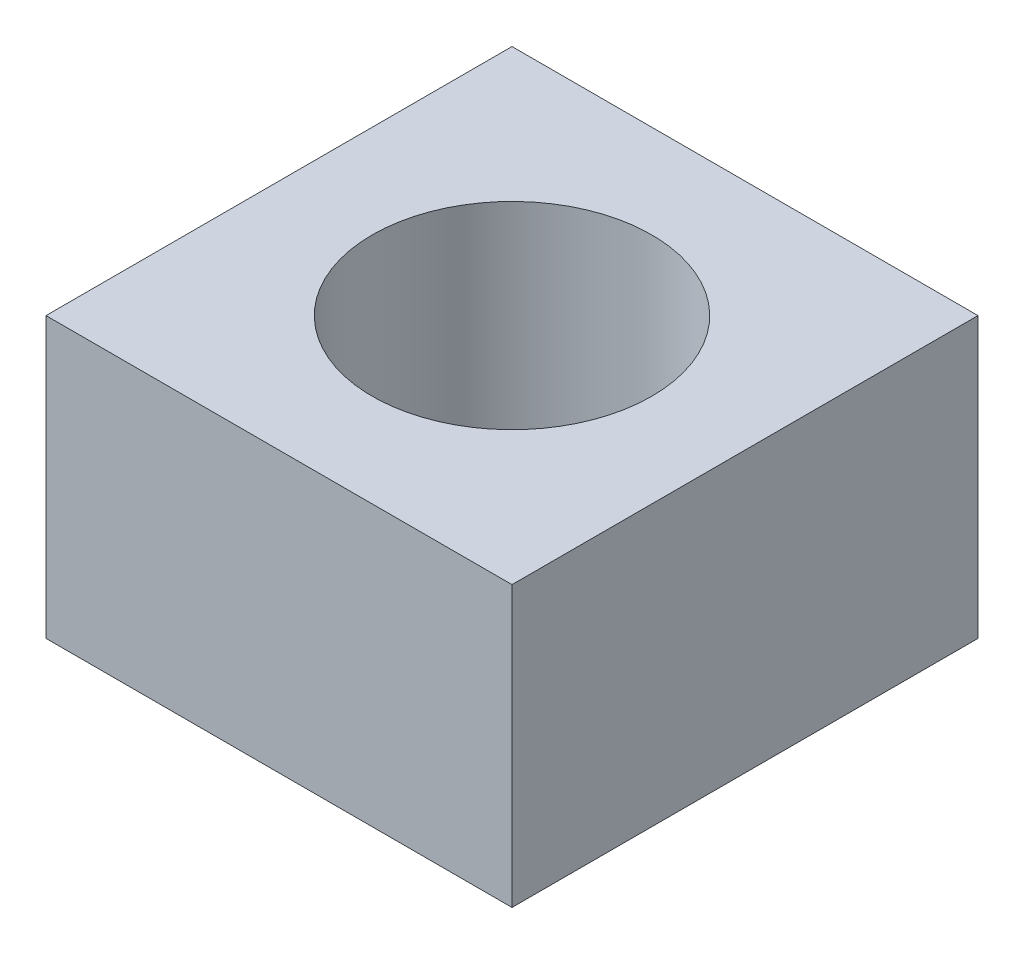
ISO-10303-21;
HEADER;
FILE_DESCRIPTION(('STEP AP214'),'2;1');
FILE_NAME('part.step','',(''),(''),'','','');
FILE_SCHEMA(('AUTOMOTIVE_DESIGN { 1 0 10303 214 1 1 1 1 }'));
ENDSEC;
DATA;
#1=APPLICATION_CONTEXT('core data for automotive mechanical design processes');
#2=APPLICATION_PROTOCOL_DEFINITION('international standard','automotive_design',2000,#1);
#3=PRODUCT_CONTEXT('',#1,'mechanical');
#4=PRODUCT('Part','Part','',(#3));
#5=PRODUCT_RELATED_PRODUCT_CATEGORY('part','',(#4));
#6=PRODUCT_DEFINITION_FORMATION('','',#4);
#7=PRODUCT_DEFINITION_CONTEXT('part definition',#1,'design');
#8=PRODUCT_DEFINITION('design','',#6,#7);
#9=PRODUCT_DEFINITION_SHAPE('','',#8);
#10=(LENGTH_UNIT() NAMED_UNIT(*) SI_UNIT(.MILLI.,.METRE.));
#11=(NAMED_UNIT(*) PLANE_ANGLE_UNIT() SI_UNIT($,.RADIAN.));
#12=(NAMED_UNIT(*) SI_UNIT($,.STERADIAN.) SOLID_ANGLE_UNIT());
#13=UNCERTAINTY_MEASURE_WITH_UNIT(LENGTH_MEASURE(1.E-05),#10,'distance_accuracy_value','');
#14=(GEOMETRIC_REPRESENTATION_CONTEXT(3) GLOBAL_UNCERTAINTY_ASSIGNED_CONTEXT((#13)) GLOBAL_UNIT_ASSIGNED_CONTEXT((#10,
#11,#12)) REPRESENTATION_CONTEXT('',''));
#15=CARTESIAN_POINT('',(0.,0.,0.));
#16=DIRECTION('',(0.,0.,1.));
#17=DIRECTION('',(1.,0.,0.));
#18=AXIS2_PLACEMENT_3D('',#15,#16,#17);
#19=CARTESIAN_POINT('',(0.,3.,5.));
#20=DIRECTION('',(1.,0.,0.));
#21=DIRECTION('',(0.,0.,-1.));
#22=AXIS2_PLACEMENT_3D('',#19,#20,#21);
#23=PLANE('',#22);
#24=DIRECTION('',(0.,-1.,0.));
#25=VECTOR('',#24,1.);
#26=CARTESIAN_POINT('',(0.,3.,0.));
#27=LINE('',#26,#25);
#28=CARTESIAN_POINT('',(0.,3.,0.));
#29=VERTEX_POINT('',#28);
#30=CARTESIAN_POINT('',(0.,0.,0.));
#31=VERTEX_POINT('',#30);
#32=EDGE_CURVE('E102',#29,#31,#27,.T.);
#33=ORIENTED_EDGE('',*,*,#32,.T.);
#34=DIRECTION('',(0.,0.,-1.));
#35=VECTOR('',#34,1.);
#36=CARTESIAN_POINT('',(0.,0.,5.));
#37=LINE('',#36,#35);
#38=CARTESIAN_POINT('',(0.,0.,5.));
#39=VERTEX_POINT('',#38);
#40=EDGE_CURVE('E11',#39,#31,#37,.T.);
#41=ORIENTED_EDGE('',*,*,#40,.F.);
#42=DIRECTION('',(0.,-1.,0.));
#43=VECTOR('',#42,1.);
#44=CARTESIAN_POINT('',(0.,3.,5.));
#45=LINE('',#44,#43);
#46=CARTESIAN_POINT('',(0.,3.,5.));
#47=VERTEX_POINT('',#46);
#48=EDGE_CURVE('E90',#47,#39,#45,.T.);
#49=ORIENTED_EDGE('',*,*,#48,.F.);
#50=DIRECTION('',(0.,0.,-1.));
#51=VECTOR('',#50,1.);
#52=CARTESIAN_POINT('',(0.,3.,5.));
#53=LINE('',#52,#51);
#54=EDGE_CURVE('E98',#47,#29,#53,.T.);
#55=ORIENTED_EDGE('',*,*,#54,.T.);
#56=EDGE_LOOP('',(#33,#41,#49,#55));
#57=FACE_BOUND('',#56,.T.);
#58=ADVANCED_FACE('F39',(#57),#23,.F.);
#59=CARTESIAN_POINT('',(0.,0.,5.));
#60=DIRECTION('',(0.,1.,0.));
#61=DIRECTION('',(0.,0.,1.));
#62=AXIS2_PLACEMENT_3D('',#59,#60,#61);
#63=PLANE('',#62);
#64=CARTESIAN_POINT('',(2.5,0.,2.5));
#65=DIRECTION('',(0.,1.,0.));
#66=DIRECTION('',(-1.,0.,0.));
#67=AXIS2_PLACEMENT_3D('',#64,#65,#66);
#68=CIRCLE('',#67,1.5);
#69=CARTESIAN_POINT('',(1.,0.,2.5));
#70=VERTEX_POINT('',#69);
#71=EDGE_CURVE('E105',#70,#70,#68,.T.);
#72=ORIENTED_EDGE('',*,*,#71,.T.);
#73=EDGE_LOOP('',(#72));
#74=FACE_BOUND('',#73,.T.);
#75=DIRECTION('',(1.,0.,0.));
#76=VECTOR('',#75,1.);
#77=CARTESIAN_POINT('',(0.,0.,0.));
#78=LINE('',#77,#76);
#79=CARTESIAN_POINT('',(5.,0.,0.));
#80=VERTEX_POINT('',#79);
#81=EDGE_CURVE('E94',#31,#80,#78,.T.);
#82=ORIENTED_EDGE('',*,*,#81,.T.);
#83=DIRECTION('',(0.,0.,-1.));
#84=VECTOR('',#83,1.);
#85=CARTESIAN_POINT('',(5.,0.,5.));
#86=LINE('',#85,#84);
#87=CARTESIAN_POINT('',(5.,0.,5.));
#88=VERTEX_POINT('',#87);
#89=EDGE_CURVE('E47',#88,#80,#86,.T.);
#90=ORIENTED_EDGE('',*,*,#89,.F.);
#91=DIRECTION('',(1.,0.,0.));
#92=VECTOR('',#91,1.);
#93=CARTESIAN_POINT('',(0.,0.,5.));
#94=LINE('',#93,#92);
#95=EDGE_CURVE('E85',#39,#88,#94,.T.);
#96=ORIENTED_EDGE('',*,*,#95,.F.);
#97=ORIENTED_EDGE('',*,*,#40,.T.);
#98=EDGE_LOOP('',(#82,#90,#96,#97));
#99=FACE_BOUND('',#98,.T.);
#100=ADVANCED_FACE('F93',(#74,#99),#63,.F.);
#101=CARTESIAN_POINT('',(5.,0.,5.));
#102=DIRECTION('',(-1.,0.,0.));
#103=DIRECTION('',(0.,0.,1.));
#104=AXIS2_PLACEMENT_3D('',#101,#102,#103);
#105=PLANE('',#104);
#106=DIRECTION('',(0.,1.,0.));
#107=VECTOR('',#106,1.);
#108=CARTESIAN_POINT('',(5.,0.,0.));
#109=LINE('',#108,#107);
#110=CARTESIAN_POINT('',(5.,3.,0.));
#111=VERTEX_POINT('',#110);
#112=EDGE_CURVE('E72',#80,#111,#109,.T.);
#113=ORIENTED_EDGE('',*,*,#112,.T.);
#114=DIRECTION('',(0.,0.,-1.));
#115=VECTOR('',#114,1.);
#116=CARTESIAN_POINT('',(5.,3.,5.));
#117=LINE('',#116,#115);
#118=CARTESIAN_POINT('',(5.,3.,5.));
#119=VERTEX_POINT('',#118);
#120=EDGE_CURVE('E95',#119,#111,#117,.T.);
#121=ORIENTED_EDGE('',*,*,#120,.F.);
#122=DIRECTION('',(0.,1.,0.));
#123=VECTOR('',#122,1.);
#124=CARTESIAN_POINT('',(5.,0.,5.));
#125=LINE('',#124,#123);
#126=EDGE_CURVE('E88',#88,#119,#125,.T.);
#127=ORIENTED_EDGE('',*,*,#126,.F.);
#128=ORIENTED_EDGE('',*,*,#89,.T.);
#129=EDGE_LOOP('',(#113,#121,#127,#128));
#130=FACE_BOUND('',#129,.T.);
#131=ADVANCED_FACE('F96',(#130),#105,.F.);
#132=CARTESIAN_POINT('',(5.,3.,5.));
#133=DIRECTION('',(0.,-1.,0.));
#134=DIRECTION('',(1.,0.,0.));
#135=AXIS2_PLACEMENT_3D('',#132,#133,#134);
#136=PLANE('',#135);
#137=CARTESIAN_POINT('',(2.5,3.,2.5));
#138=DIRECTION('',(0.,1.,0.));
#139=DIRECTION('',(-1.,0.,0.));
#140=AXIS2_PLACEMENT_3D('',#137,#138,#139);
#141=CIRCLE('',#140,1.5);
#142=CARTESIAN_POINT('',(0.999999999999999,3.,2.5));
#143=VERTEX_POINT('',#142);
#144=EDGE_CURVE('E116',#143,#143,#141,.T.);
#145=ORIENTED_EDGE('',*,*,#144,.F.);
#146=EDGE_LOOP('',(#145));
#147=FACE_BOUND('',#146,.T.);
#148=DIRECTION('',(-1.,0.,0.));
#149=VECTOR('',#148,1.);
#150=CARTESIAN_POINT('',(5.,3.,0.));
#151=LINE('',#150,#149);
#152=EDGE_CURVE('E78',#111,#29,#151,.T.);
#153=ORIENTED_EDGE('',*,*,#152,.T.);
#154=ORIENTED_EDGE('',*,*,#54,.F.);
#155=DIRECTION('',(-1.,0.,0.));
#156=VECTOR('',#155,1.);
#157=CARTESIAN_POINT('',(5.,3.,5.));
#158=LINE('',#157,#156);
#159=EDGE_CURVE('E55',#119,#47,#158,.T.);
#160=ORIENTED_EDGE('',*,*,#159,.F.);
#161=ORIENTED_EDGE('',*,*,#120,.T.);
#162=EDGE_LOOP('',(#153,#154,#160,#161));
#163=FACE_BOUND('',#162,.T.);
#164=ADVANCED_FACE('F110',(#147,#163),#136,.F.);
#165=CARTESIAN_POINT('',(0.,0.,5.));
#166=DIRECTION('',(0.,0.,1.));
#167=DIRECTION('',(1.,0.,0.));
#168=AXIS2_PLACEMENT_3D('',#165,#166,#167);
#169=PLANE('',#168);
#170=ORIENTED_EDGE('',*,*,#48,.T.);
#171=ORIENTED_EDGE('',*,*,#95,.T.);
#172=ORIENTED_EDGE('',*,*,#126,.T.);
#173=ORIENTED_EDGE('',*,*,#159,.T.);
#174=EDGE_LOOP('',(#170,#171,#172,#173));
#175=FACE_BOUND('',#174,.T.);
#176=ADVANCED_FACE('F86',(#175),#169,.T.);
#177=CARTESIAN_POINT('',(0.,0.,0.));
#178=DIRECTION('',(0.,0.,1.));
#179=DIRECTION('',(1.,0.,0.));
#180=AXIS2_PLACEMENT_3D('',#177,#178,#179);
#181=PLANE('',#180);
#182=ORIENTED_EDGE('',*,*,#32,.F.);
#183=ORIENTED_EDGE('',*,*,#152,.F.);
#184=ORIENTED_EDGE('',*,*,#112,.F.);
#185=ORIENTED_EDGE('',*,*,#81,.F.);
#186=EDGE_LOOP('',(#182,#183,#184,#185));
#187=FACE_BOUND('',#186,.T.);
#188=ADVANCED_FACE('F113',(#187),#181,.F.);
#189=CARTESIAN_POINT('',(2.5,0.,2.5));
#190=DIRECTION('',(0.,1.,0.));
#191=DIRECTION('',(-1.,0.,0.));
#192=AXIS2_PLACEMENT_3D('',#189,#190,#191);
#193=CYLINDRICAL_SURFACE('',#192,1.5);
#194=CARTESIAN_POINT('',(1.,0.,2.5));
#195=CARTESIAN_POINT('',(1.,0.0312499999999994,2.5));
#196=CARTESIAN_POINT('',(1.,0.0624999999999994,2.5));
#197=CARTESIAN_POINT('',(1.,0.124999999999999,2.5));
#198=CARTESIAN_POINT('',(1.,0.156249999999999,2.5));
#199=CARTESIAN_POINT('',(1.,0.218749999999999,2.5));
#200=CARTESIAN_POINT('',(1.,0.249999999999999,2.5));
#201=CARTESIAN_POINT('',(1.,0.3125,2.5));
#202=CARTESIAN_POINT('',(1.,0.34375,2.5));
#203=CARTESIAN_POINT('',(1.,0.40625,2.5));
#204=CARTESIAN_POINT('',(1.,0.4375,2.5));
#205=CARTESIAN_POINT('',(1.,0.5,2.5));
#206=CARTESIAN_POINT('',(1.,0.531249999999999,2.5));
#207=CARTESIAN_POINT('',(1.,0.59375,2.5));
#208=CARTESIAN_POINT('',(1.,0.624999999999999,2.5));
#209=CARTESIAN_POINT('',(1.,0.6875,2.5));
#210=CARTESIAN_POINT('',(1.,0.71875,2.5));
#211=CARTESIAN_POINT('',(1.,0.78125,2.5));
#212=CARTESIAN_POINT('',(1.,0.8125,2.5));
#213=CARTESIAN_POINT('',(1.,0.875,2.5));
#214=CARTESIAN_POINT('',(1.,0.90625,2.5));
#215=CARTESIAN_POINT('',(1.,0.96875,2.5));
#216=CARTESIAN_POINT('',(1.,0.999999999999999,2.5));
#217=CARTESIAN_POINT('',(1.,1.0625,2.5));
#218=CARTESIAN_POINT('',(1.,1.09375,2.5));
#219=CARTESIAN_POINT('',(1.,1.15625,2.5));
#220=CARTESIAN_POINT('',(1.,1.1875,2.5));
#221=CARTESIAN_POINT('',(1.,1.25,2.5));
#222=CARTESIAN_POINT('',(0.999999999999999,1.28125,2.5));
#223=CARTESIAN_POINT('',(0.999999999999999,1.34375,2.5));
#224=CARTESIAN_POINT('',(0.999999999999999,1.375,2.5));
#225=CARTESIAN_POINT('',(0.999999999999999,1.4375,2.5));
#226=CARTESIAN_POINT('',(0.999999999999999,1.46875,2.5));
#227=CARTESIAN_POINT('',(0.999999999999999,1.53125,2.5));
#228=CARTESIAN_POINT('',(0.999999999999999,1.5625,2.5));
#229=CARTESIAN_POINT('',(0.999999999999999,1.625,2.5));
#230=CARTESIAN_POINT('',(0.999999999999999,1.65625,2.5));
#231=CARTESIAN_POINT('',(0.999999999999999,1.71875,2.5));
#232=CARTESIAN_POINT('',(0.999999999999999,1.75,2.5));
#233=CARTESIAN_POINT('',(0.999999999999999,1.8125,2.5));
#234=CARTESIAN_POINT('',(0.999999999999999,1.84375,2.5));
#235=CARTESIAN_POINT('',(0.999999999999999,1.90625,2.5));
#236=CARTESIAN_POINT('',(0.999999999999999,1.9375,2.5));
#237=CARTESIAN_POINT('',(0.999999999999999,2.,2.5));
#238=CARTESIAN_POINT('',(0.999999999999999,2.03125,2.5));
#239=CARTESIAN_POINT('',(0.999999999999999,2.09375,2.5));
#240=CARTESIAN_POINT('',(0.999999999999999,2.125,2.5));
#241=CARTESIAN_POINT('',(0.999999999999999,2.1875,2.5));
#242=CARTESIAN_POINT('',(0.999999999999999,2.21875,2.5));
#243=CARTESIAN_POINT('',(0.999999999999999,2.28125,2.5));
#244=CARTESIAN_POINT('',(0.999999999999999,2.3125,2.5));
#245=CARTESIAN_POINT('',(0.999999999999999,2.375,2.5));
#246=CARTESIAN_POINT('',(0.999999999999999,2.40625,2.5));
#247=CARTESIAN_POINT('',(0.999999999999999,2.46875,2.5));
#248=CARTESIAN_POINT('',(0.999999999999999,2.5,2.5));
#249=CARTESIAN_POINT('',(0.999999999999999,2.5625,2.5));
#250=CARTESIAN_POINT('',(0.999999999999999,2.59375,2.5));
#251=CARTESIAN_POINT('',(0.999999999999999,2.65625,2.5));
#252=CARTESIAN_POINT('',(0.999999999999999,2.6875,2.5));
#253=CARTESIAN_POINT('',(0.999999999999999,2.75,2.5));
#254=CARTESIAN_POINT('',(0.999999999999999,2.78125,2.5));
#255=CARTESIAN_POINT('',(0.999999999999999,2.84375,2.5));
#256=CARTESIAN_POINT('',(0.999999999999999,2.875,2.5));
#257=CARTESIAN_POINT('',(0.999999999999999,2.9375,2.5));
#258=CARTESIAN_POINT('',(0.999999999999999,2.96875,2.5));
#259=CARTESIAN_POINT('',(0.999999999999999,3.,2.5));
#260=B_SPLINE_CURVE_WITH_KNOTS('',3,(#194,#195,#196,#197,#198,#199,#200,#201,#202,#203,#204,
#205,#206,#207,#208,#209,#210,#211,#212,#213,#214,#215,#216,#217,#218,#219,#220,#221,#222,#223,
#224,#225,#226,#227,#228,#229,#230,#231,#232,#233,#234,#235,#236,#237,#238,#239,#240,#241,#242,
#243,#244,#245,#246,#247,#248,#249,#250,#251,#252,#253,#254,#255,#256,#257,#258,#259),
.UNSPECIFIED.,.F.,.F.,(4,2,2,2,2,2,2,2,2,2,2,2,2,2,2,2,2,2,2,2,2,2,2,2,2,2,2,2,2,2,2,2,4),(0.,
0.09375,0.1875,0.28125,0.375,0.46875,0.5625,0.65625,0.75,0.84375,0.9375,1.03125,1.125,1.21875,
1.3125,1.40625,1.5,1.59375,1.6875,1.78125,1.875,1.96875,2.0625,2.15625,2.25,2.34375,2.4375,
2.53125,2.625,2.71875,2.8125,2.90625,3.),.UNSPECIFIED.);
#261=EDGE_CURVE('BSEAM123',#70,#143,#260,.T.);
#262=ORIENTED_EDGE('',*,*,#71,.F.);
#263=ORIENTED_EDGE('',*,*,#144,.T.);
#264=ORIENTED_EDGE('',*,*,#261,.T.);
#265=ORIENTED_EDGE('',*,*,#261,.F.);
#266=EDGE_LOOP('',(#262,#264,#263,#265));
#267=FACE_BOUND('',#266,.T.);
#268=ADVANCED_FACE('F123',(#267),#193,.F.);
#269=CLOSED_SHELL('',(#58,#100,#131,#164,#176,#188,#268));
#270=MANIFOLD_SOLID_BREP('B2',#269);
#271=ADVANCED_BREP_SHAPE_REPRESENTATION('',(#18,#270),#14);
#272=SHAPE_DEFINITION_REPRESENTATION(#9,#271);
ENDSEC;
END-ISO-10303-21;
